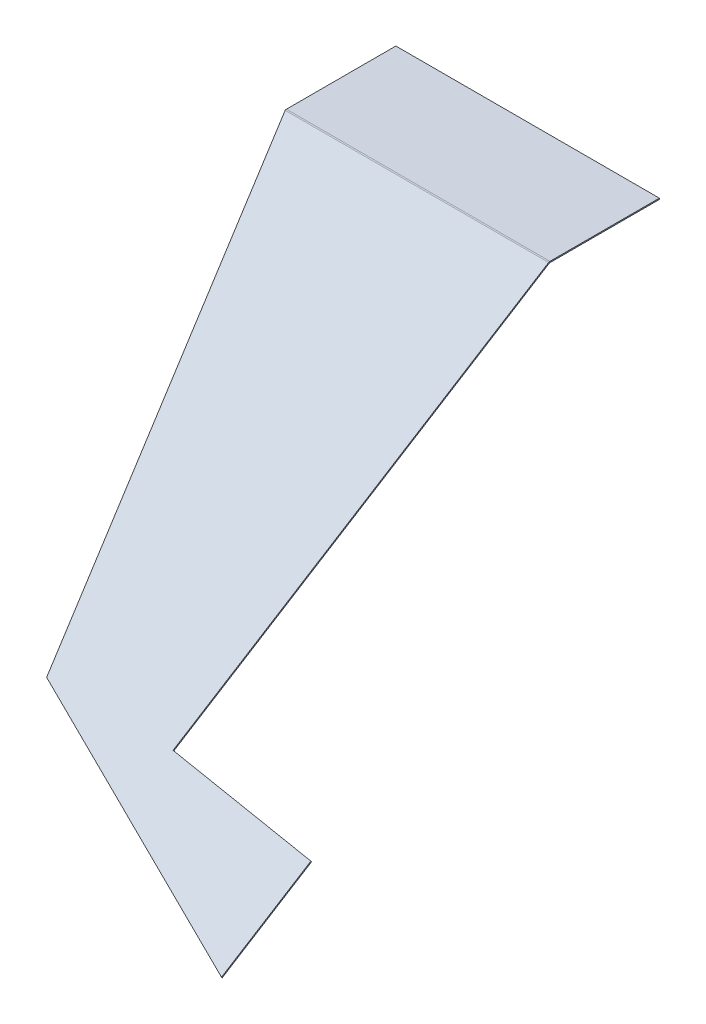
ISO-10303-21;
HEADER;
FILE_DESCRIPTION(('STEP AP214'),'2;1');
FILE_NAME('part.step','',(''),(''),'','','');
FILE_SCHEMA(('AUTOMOTIVE_DESIGN { 1 0 10303 214 1 1 1 1 }'));
ENDSEC;
DATA;
#1=APPLICATION_CONTEXT('core data for automotive mechanical design processes');
#2=APPLICATION_PROTOCOL_DEFINITION('international standard','automotive_design',2000,#1);
#3=PRODUCT_CONTEXT('',#1,'mechanical');
#4=PRODUCT('Part','Part','',(#3));
#5=PRODUCT_RELATED_PRODUCT_CATEGORY('part','',(#4));
#6=PRODUCT_DEFINITION_FORMATION('','',#4);
#7=PRODUCT_DEFINITION_CONTEXT('part definition',#1,'design');
#8=PRODUCT_DEFINITION('design','',#6,#7);
#9=PRODUCT_DEFINITION_SHAPE('','',#8);
#10=(LENGTH_UNIT() NAMED_UNIT(*) SI_UNIT(.MILLI.,.METRE.));
#11=(NAMED_UNIT(*) PLANE_ANGLE_UNIT() SI_UNIT($,.RADIAN.));
#12=(NAMED_UNIT(*) SI_UNIT($,.STERADIAN.) SOLID_ANGLE_UNIT());
#13=UNCERTAINTY_MEASURE_WITH_UNIT(LENGTH_MEASURE(1.E-05),#10,'distance_accuracy_value','');
#14=(GEOMETRIC_REPRESENTATION_CONTEXT(3) GLOBAL_UNCERTAINTY_ASSIGNED_CONTEXT((#13)) GLOBAL_UNIT_ASSIGNED_CONTEXT((#10,
#11,#12)) REPRESENTATION_CONTEXT('',''));
#15=CARTESIAN_POINT('',(0.,0.,0.));
#16=DIRECTION('',(0.,0.,1.));
#17=DIRECTION('',(1.,0.,0.));
#18=AXIS2_PLACEMENT_3D('',#15,#16,#17);
#19=CARTESIAN_POINT('',(-90.,-0.121561523074852,37.9239354113866));
#20=DIRECTION('',(0.,0.848048096156429,0.5299192642332));
#21=DIRECTION('',(0.,-0.5299192642332,0.848048096156429));
#22=AXIS2_PLACEMENT_3D('',#19,#20,#21);
#23=PLANE('',#22);
#24=DIRECTION('',(-1.,0.,0.));
#25=VECTOR('',#24,1.);
#26=CARTESIAN_POINT('',(-90.,-0.243123046149712,38.1184745141661));
#27=LINE('',#26,#25);
#28=CARTESIAN_POINT('',(90.,-0.24312304614971,38.1184745141661));
#29=VERTEX_POINT('',#28);
#30=CARTESIAN_POINT('',(-90.,-0.243123046149711,38.1184745141661));
#31=VERTEX_POINT('',#30);
#32=EDGE_CURVE('E150',#29,#31,#27,.T.);
#33=ORIENTED_EDGE('',*,*,#32,.T.);
#34=DIRECTION('',(-0.295708050044041,0.50622040679377,-0.810121996297287));
#35=VECTOR('',#34,1.);
#36=CARTESIAN_POINT('',(-90.0648006725352,-0.132191257832115,37.9409465429531));
#37=LINE('',#36,#35);
#38=CARTESIAN_POINT('',(3.65214793975983,-160.56553706266,294.687969444005));
#39=VERTEX_POINT('',#38);
#40=EDGE_CURVE('E123',#39,#31,#37,.T.);
#41=ORIENTED_EDGE('',*,*,#40,.F.);
#42=DIRECTION('',(0.913601253818773,-0.21547116075097,0.344825938562336));
#43=VECTOR('',#42,1.);
#44=CARTESIAN_POINT('',(3.65214793975983,-160.56553706266,294.687969444005));
#45=LINE('',#44,#43);
#46=CARTESIAN_POINT('',(195.499061090279,-205.812275604497,367.097887459001));
#47=VERTEX_POINT('',#46);
#48=EDGE_CURVE('E118',#39,#47,#45,.T.);
#49=ORIENTED_EDGE('',*,*,#48,.T.);
#50=DIRECTION('',(0.,0.5299192642332,-0.848048096156429));
#51=VECTOR('',#50,1.);
#52=CARTESIAN_POINT('',(195.499061090279,-205.812275604497,367.097887459001));
#53=LINE('',#52,#51);
#54=CARTESIAN_POINT('',(195.499061090279,-167.659772999828,306.041120171419));
#55=VERTEX_POINT('',#54);
#56=EDGE_CURVE('E254',#47,#55,#53,.T.);
#57=ORIENTED_EDGE('',*,*,#56,.T.);
#58=DIRECTION('',(-0.992044672987226,0.0667095886697956,-0.106757658166401));
#59=VECTOR('',#58,1.);
#60=CARTESIAN_POINT('',(195.499061090279,-167.659772999828,306.041120171419));
#61=LINE('',#60,#59);
#62=CARTESIAN_POINT('',(90.,-160.56553706266,294.687969444005));
#63=VERTEX_POINT('',#62);
#64=EDGE_CURVE('E135',#55,#63,#61,.T.);
#65=ORIENTED_EDGE('',*,*,#64,.T.);
#66=DIRECTION('',(0.,-0.5299192642332,0.848048096156429));
#67=VECTOR('',#66,1.);
#68=CARTESIAN_POINT('',(90.,-160.56553706266,294.687969444005));
#69=LINE('',#68,#67);
#70=EDGE_CURVE('E156',#29,#63,#69,.T.);
#71=ORIENTED_EDGE('',*,*,#70,.F.);
#72=EDGE_LOOP('',(#33,#41,#49,#57,#65,#71));
#73=FACE_BOUND('',#72,.T.);
#74=ADVANCED_FACE('F35',(#73),#23,.T.);
#75=CARTESIAN_POINT('',(-90.,-0.799999999999995,37.5));
#76=DIRECTION('',(0.,0.848048096156429,0.5299192642332));
#77=DIRECTION('',(0.,-0.5299192642332,0.848048096156429));
#78=AXIS2_PLACEMENT_3D('',#75,#76,#77);
#79=PLANE('',#78);
#80=DIRECTION('',(-0.295708050044041,0.50622040679377,-0.810121996297287));
#81=VECTOR('',#80,1.);
#82=CARTESIAN_POINT('',(-90.0648006725352,-0.810629734757257,37.5170111315666));
#83=LINE('',#82,#81);
#84=CARTESIAN_POINT('',(3.65214793975983,-161.243975539585,294.264034032619));
#85=VERTEX_POINT('',#84);
#86=CARTESIAN_POINT('',(-90.,-0.921561523074853,37.6945391027795));
#87=VERTEX_POINT('',#86);
#88=EDGE_CURVE('E130',#85,#87,#83,.T.);
#89=ORIENTED_EDGE('',*,*,#88,.T.);
#90=DIRECTION('',(-1.,0.,0.));
#91=VECTOR('',#90,1.);
#92=CARTESIAN_POINT('',(90.,-0.921561523074852,37.6945391027795));
#93=LINE('',#92,#91);
#94=CARTESIAN_POINT('',(90.,-0.921561523074857,37.6945391027795));
#95=VERTEX_POINT('',#94);
#96=EDGE_CURVE('E147',#95,#87,#93,.T.);
#97=ORIENTED_EDGE('',*,*,#96,.F.);
#98=DIRECTION('',(0.,-0.5299192642332,0.848048096156429));
#99=VECTOR('',#98,1.);
#100=CARTESIAN_POINT('',(90.,-161.243975539585,294.264034032618));
#101=LINE('',#100,#99);
#102=CARTESIAN_POINT('',(90.,-161.243975539585,294.264034032618));
#103=VERTEX_POINT('',#102);
#104=EDGE_CURVE('E155',#95,#103,#101,.T.);
#105=ORIENTED_EDGE('',*,*,#104,.T.);
#106=DIRECTION('',(-0.992044672987226,0.0667095886697956,-0.106757658166401));
#107=VECTOR('',#106,1.);
#108=CARTESIAN_POINT('',(195.499061090279,-168.338211476753,305.617184760033));
#109=LINE('',#108,#107);
#110=CARTESIAN_POINT('',(195.499061090279,-168.338211476753,305.617184760033));
#111=VERTEX_POINT('',#110);
#112=EDGE_CURVE('E219',#111,#103,#109,.T.);
#113=ORIENTED_EDGE('',*,*,#112,.F.);
#114=DIRECTION('',(0.,0.5299192642332,-0.848048096156429));
#115=VECTOR('',#114,1.);
#116=CARTESIAN_POINT('',(195.499061090279,-206.490714081422,366.673952047614));
#117=LINE('',#116,#115);
#118=CARTESIAN_POINT('',(195.499061090279,-206.490714081422,366.673952047614));
#119=VERTEX_POINT('',#118);
#120=EDGE_CURVE('E134',#119,#111,#117,.T.);
#121=ORIENTED_EDGE('',*,*,#120,.F.);
#122=DIRECTION('',(0.913601253818773,-0.21547116075097,0.344825938562336));
#123=VECTOR('',#122,1.);
#124=CARTESIAN_POINT('',(3.65214793975983,-161.243975539585,294.264034032619));
#125=LINE('',#124,#123);
#126=EDGE_CURVE('E116',#85,#119,#125,.T.);
#127=ORIENTED_EDGE('',*,*,#126,.F.);
#128=EDGE_LOOP('',(#89,#97,#105,#113,#121,#127));
#129=FACE_BOUND('',#128,.T.);
#130=ADVANCED_FACE('F128',(#129),#79,.F.);
#131=CARTESIAN_POINT('',(-90.,-0.8,37.5));
#132=DIRECTION('',(-1.,0.,0.));
#133=DIRECTION('',(0.,0.,1.));
#134=AXIS2_PLACEMENT_3D('',#131,#132,#133);
#135=PLANE('',#134);
#136=DIRECTION('',(0.,0.,1.));
#137=VECTOR('',#136,1.);
#138=CARTESIAN_POINT('',(-90.,-0.8,37.5));
#139=LINE('',#138,#137);
#140=CARTESIAN_POINT('',(-90.,-0.8,-37.5));
#141=VERTEX_POINT('',#140);
#142=CARTESIAN_POINT('',(-90.,-0.8,37.270603691393));
#143=VERTEX_POINT('',#142);
#144=EDGE_CURVE('E189',#141,#143,#139,.T.);
#145=ORIENTED_EDGE('',*,*,#144,.T.);
#146=DIRECTION('',(0.,1.,0.));
#147=VECTOR('',#146,1.);
#148=CARTESIAN_POINT('',(-89.9999999999999,-0.800000000000032,37.270603691393));
#149=LINE('',#148,#147);
#150=CARTESIAN_POINT('',(-89.9999999999999,0.,37.270603691393));
#151=VERTEX_POINT('',#150);
#152=EDGE_CURVE('E171',#143,#151,#149,.T.);
#153=ORIENTED_EDGE('',*,*,#152,.T.);
#154=DIRECTION('',(0.,0.,1.));
#155=VECTOR('',#154,1.);
#156=CARTESIAN_POINT('',(-90.,0.,37.5));
#157=LINE('',#156,#155);
#158=CARTESIAN_POINT('',(-90.,0.,-37.5));
#159=VERTEX_POINT('',#158);
#160=EDGE_CURVE('E186',#159,#151,#157,.T.);
#161=ORIENTED_EDGE('',*,*,#160,.F.);
#162=DIRECTION('',(0.,1.,0.));
#163=VECTOR('',#162,1.);
#164=CARTESIAN_POINT('',(-90.,-0.8,-37.5));
#165=LINE('',#164,#163);
#166=EDGE_CURVE('E11',#141,#159,#165,.T.);
#167=ORIENTED_EDGE('',*,*,#166,.F.);
#168=EDGE_LOOP('',(#145,#153,#161,#167));
#169=FACE_BOUND('',#168,.T.);
#170=ADVANCED_FACE('F236',(#169),#135,.T.);
#171=CARTESIAN_POINT('',(89.9999999999999,-0.8,-37.5));
#172=DIRECTION('',(0.,-1.,0.));
#173=DIRECTION('',(0.,0.,-1.));
#174=AXIS2_PLACEMENT_3D('',#171,#172,#173);
#175=PLANE('',#174);
#176=DIRECTION('',(0.,0.,-1.));
#177=VECTOR('',#176,1.);
#178=CARTESIAN_POINT('',(90.,-0.8,37.5));
#179=LINE('',#178,#177);
#180=CARTESIAN_POINT('',(90.,-0.8,37.270603691393));
#181=VERTEX_POINT('',#180);
#182=CARTESIAN_POINT('',(90.,-0.8,-37.5));
#183=VERTEX_POINT('',#182);
#184=EDGE_CURVE('E183',#181,#183,#179,.T.);
#185=ORIENTED_EDGE('',*,*,#184,.F.);
#186=DIRECTION('',(-1.,0.,0.));
#187=VECTOR('',#186,1.);
#188=CARTESIAN_POINT('',(-90.,-0.800000000000032,37.270603691393));
#189=LINE('',#188,#187);
#190=EDGE_CURVE('E50',#143,#181,#189,.F.);
#191=ORIENTED_EDGE('',*,*,#190,.F.);
#192=ORIENTED_EDGE('',*,*,#144,.F.);
#193=DIRECTION('',(-1.,0.,0.));
#194=VECTOR('',#193,1.);
#195=CARTESIAN_POINT('',(-90.,-0.8,-37.5));
#196=LINE('',#195,#194);
#197=EDGE_CURVE('E185',#183,#141,#196,.T.);
#198=ORIENTED_EDGE('',*,*,#197,.F.);
#199=EDGE_LOOP('',(#185,#191,#192,#198));
#200=FACE_BOUND('',#199,.T.);
#201=ADVANCED_FACE('F355',(#200),#175,.T.);
#202=CARTESIAN_POINT('',(89.9999999999999,0.,-37.5));
#203=DIRECTION('',(0.,-1.,0.));
#204=DIRECTION('',(0.,0.,-1.));
#205=AXIS2_PLACEMENT_3D('',#202,#203,#204);
#206=PLANE('',#205);
#207=DIRECTION('',(-1.,0.,0.));
#208=VECTOR('',#207,1.);
#209=CARTESIAN_POINT('',(-90.,0.,37.270603691393));
#210=LINE('',#209,#208);
#211=CARTESIAN_POINT('',(90.,0.,37.270603691393));
#212=VERTEX_POINT('',#211);
#213=EDGE_CURVE('E165',#151,#212,#210,.F.);
#214=ORIENTED_EDGE('',*,*,#213,.T.);
#215=DIRECTION('',(0.,0.,-1.));
#216=VECTOR('',#215,1.);
#217=CARTESIAN_POINT('',(90.,0.,37.5));
#218=LINE('',#217,#216);
#219=CARTESIAN_POINT('',(90.,0.,-37.5));
#220=VERTEX_POINT('',#219);
#221=EDGE_CURVE('E181',#212,#220,#218,.T.);
#222=ORIENTED_EDGE('',*,*,#221,.T.);
#223=DIRECTION('',(-1.,0.,0.));
#224=VECTOR('',#223,1.);
#225=CARTESIAN_POINT('',(-90.,0.,-37.5));
#226=LINE('',#225,#224);
#227=EDGE_CURVE('E192',#220,#159,#226,.T.);
#228=ORIENTED_EDGE('',*,*,#227,.T.);
#229=ORIENTED_EDGE('',*,*,#160,.T.);
#230=EDGE_LOOP('',(#214,#222,#228,#229));
#231=FACE_BOUND('',#230,.T.);
#232=ADVANCED_FACE('F199',(#231),#206,.F.);
#233=CARTESIAN_POINT('',(90.,-0.8,37.5));
#234=DIRECTION('',(1.,0.,0.));
#235=DIRECTION('',(0.,0.,-1.));
#236=AXIS2_PLACEMENT_3D('',#233,#234,#235);
#237=PLANE('',#236);
#238=DIRECTION('',(0.,1.,0.));
#239=VECTOR('',#238,1.);
#240=CARTESIAN_POINT('',(90.,-0.800000000000008,37.270603691393));
#241=LINE('',#240,#239);
#242=EDGE_CURVE('E58',#181,#212,#241,.T.);
#243=ORIENTED_EDGE('',*,*,#242,.F.);
#244=ORIENTED_EDGE('',*,*,#184,.T.);
#245=DIRECTION('',(0.,1.,0.));
#246=VECTOR('',#245,1.);
#247=CARTESIAN_POINT('',(90.,-0.8,-37.5));
#248=LINE('',#247,#246);
#249=EDGE_CURVE('E39',#183,#220,#248,.T.);
#250=ORIENTED_EDGE('',*,*,#249,.T.);
#251=ORIENTED_EDGE('',*,*,#221,.F.);
#252=EDGE_LOOP('',(#243,#244,#250,#251));
#253=FACE_BOUND('',#252,.T.);
#254=ADVANCED_FACE('F37',(#253),#237,.T.);
#255=CARTESIAN_POINT('',(-90.,-0.8,-37.5));
#256=DIRECTION('',(0.,0.,-1.));
#257=DIRECTION('',(-1.,0.,0.));
#258=AXIS2_PLACEMENT_3D('',#255,#256,#257);
#259=PLANE('',#258);
#260=ORIENTED_EDGE('',*,*,#227,.F.);
#261=ORIENTED_EDGE('',*,*,#249,.F.);
#262=ORIENTED_EDGE('',*,*,#197,.T.);
#263=ORIENTED_EDGE('',*,*,#166,.T.);
#264=EDGE_LOOP('',(#260,#261,#262,#263));
#265=FACE_BOUND('',#264,.T.);
#266=ADVANCED_FACE('F346',(#265),#259,.T.);
#267=CARTESIAN_POINT('',(90.,-1.59999999999996,37.270603691393));
#268=DIRECTION('',(1.,0.,0.));
#269=DIRECTION('',(0.,1.,0.));
#270=AXIS2_PLACEMENT_3D('',#267,#268,#269);
#271=PLANE('',#270);
#272=DIRECTION('',(0.,0.848048096156429,0.5299192642332));
#273=VECTOR('',#272,1.);
#274=CARTESIAN_POINT('',(90.,-0.921561523074852,37.6945391027795));
#275=LINE('',#274,#273);
#276=EDGE_CURVE('E122',#95,#29,#275,.T.);
#277=ORIENTED_EDGE('',*,*,#276,.F.);
#278=CARTESIAN_POINT('',(90.,-1.59999999999996,37.270603691393));
#279=DIRECTION('',(-1.,0.,0.));
#280=DIRECTION('',(0.,-1.,0.));
#281=AXIS2_PLACEMENT_3D('',#278,#279,#280);
#282=CIRCLE('',#281,0.799999999999948);
#283=EDGE_CURVE('E174',#181,#95,#282,.F.);
#284=ORIENTED_EDGE('',*,*,#283,.F.);
#285=ORIENTED_EDGE('',*,*,#242,.T.);
#286=CARTESIAN_POINT('',(90.,-1.59999999999996,37.270603691393));
#287=DIRECTION('',(-1.,0.,0.));
#288=DIRECTION('',(0.,-1.,0.));
#289=AXIS2_PLACEMENT_3D('',#286,#287,#288);
#290=CIRCLE('',#289,1.59999999999995);
#291=EDGE_CURVE('E167',#212,#29,#290,.F.);
#292=ORIENTED_EDGE('',*,*,#291,.T.);
#293=EDGE_LOOP('',(#277,#284,#285,#292));
#294=FACE_BOUND('',#293,.T.);
#295=ADVANCED_FACE('F214',(#294),#271,.T.);
#296=CARTESIAN_POINT('',(-89.9999999999999,-1.59999999999998,37.270603691393));
#297=DIRECTION('',(1.,0.,0.));
#298=DIRECTION('',(0.,1.,0.));
#299=AXIS2_PLACEMENT_3D('',#296,#297,#298);
#300=PLANE('',#299);
#301=CARTESIAN_POINT('',(-89.9999999999999,-1.59999999999998,37.270603691393));
#302=DIRECTION('',(-1.,0.,0.));
#303=DIRECTION('',(0.,-1.,0.));
#304=AXIS2_PLACEMENT_3D('',#301,#302,#303);
#305=CIRCLE('',#304,0.799999999999948);
#306=EDGE_CURVE('E164',#87,#143,#305,.T.);
#307=ORIENTED_EDGE('',*,*,#306,.F.);
#308=DIRECTION('',(0.,0.848048096156429,0.5299192642332));
#309=VECTOR('',#308,1.);
#310=CARTESIAN_POINT('',(-89.9999999999999,-0.921561523074852,37.6945391027795));
#311=LINE('',#310,#309);
#312=EDGE_CURVE('E139',#87,#31,#311,.T.);
#313=ORIENTED_EDGE('',*,*,#312,.T.);
#314=CARTESIAN_POINT('',(-89.9999999999999,-1.59999999999998,37.270603691393));
#315=DIRECTION('',(-1.,0.,0.));
#316=DIRECTION('',(0.,-1.,0.));
#317=AXIS2_PLACEMENT_3D('',#314,#315,#316);
#318=CIRCLE('',#317,1.59999999999995);
#319=EDGE_CURVE('E168',#31,#151,#318,.T.);
#320=ORIENTED_EDGE('',*,*,#319,.T.);
#321=ORIENTED_EDGE('',*,*,#152,.F.);
#322=EDGE_LOOP('',(#307,#313,#320,#321));
#323=FACE_BOUND('',#322,.T.);
#324=ADVANCED_FACE('F209',(#323),#300,.F.);
#325=CARTESIAN_POINT('',(-90.,-1.59999999999998,37.270603691393));
#326=DIRECTION('',(-1.,0.,0.));
#327=DIRECTION('',(0.,0.848048096156429,0.5299192642332));
#328=AXIS2_PLACEMENT_3D('',#325,#326,#327);
#329=CYLINDRICAL_SURFACE('',#328,1.59999999999995);
#330=ORIENTED_EDGE('',*,*,#213,.F.);
#331=ORIENTED_EDGE('',*,*,#319,.F.);
#332=ORIENTED_EDGE('',*,*,#32,.F.);
#333=ORIENTED_EDGE('',*,*,#291,.F.);
#334=EDGE_LOOP('',(#330,#331,#332,#333));
#335=FACE_BOUND('',#334,.T.);
#336=ADVANCED_FACE('F205',(#335),#329,.T.);
#337=CARTESIAN_POINT('',(-90.,-1.59999999999998,37.270603691393));
#338=DIRECTION('',(-1.,0.,0.));
#339=DIRECTION('',(0.,0.848048096156429,0.5299192642332));
#340=AXIS2_PLACEMENT_3D('',#337,#338,#339);
#341=CYLINDRICAL_SURFACE('',#340,0.799999999999948);
#342=ORIENTED_EDGE('',*,*,#190,.T.);
#343=ORIENTED_EDGE('',*,*,#283,.T.);
#344=ORIENTED_EDGE('',*,*,#96,.T.);
#345=ORIENTED_EDGE('',*,*,#306,.T.);
#346=EDGE_LOOP('',(#342,#343,#344,#345));
#347=FACE_BOUND('',#346,.T.);
#348=ADVANCED_FACE('F221',(#347),#341,.F.);
#349=CARTESIAN_POINT('',(90.,-160.56553706266,294.687969444005));
#350=DIRECTION('',(1.,0.,0.));
#351=DIRECTION('',(0.,0.,-1.));
#352=AXIS2_PLACEMENT_3D('',#349,#350,#351);
#353=PLANE('',#352);
#354=ORIENTED_EDGE('',*,*,#104,.F.);
#355=ORIENTED_EDGE('',*,*,#276,.T.);
#356=ORIENTED_EDGE('',*,*,#70,.T.);
#357=DIRECTION('',(0.,-0.848048096156429,-0.5299192642332));
#358=VECTOR('',#357,1.);
#359=CARTESIAN_POINT('',(90.,-160.56553706266,294.687969444005));
#360=LINE('',#359,#358);
#361=EDGE_CURVE('E159',#63,#103,#360,.T.);
#362=ORIENTED_EDGE('',*,*,#361,.T.);
#363=EDGE_LOOP('',(#354,#355,#356,#362));
#364=FACE_BOUND('',#363,.T.);
#365=ADVANCED_FACE('F218',(#364),#353,.T.);
#366=CARTESIAN_POINT('',(-90.0648006725352,-0.810629734757257,37.5170111315666));
#367=DIRECTION('',(0.955278362122346,0.156701392307172,-0.250774648857979));
#368=DIRECTION('',(-0.295708050044041,0.50622040679377,-0.810121996297287));
#369=AXIS2_PLACEMENT_3D('',#366,#367,#368);
#370=PLANE('',#369);
#371=ORIENTED_EDGE('',*,*,#312,.F.);
#372=ORIENTED_EDGE('',*,*,#88,.F.);
#373=DIRECTION('',(0.,-0.848048096156429,-0.5299192642332));
#374=VECTOR('',#373,1.);
#375=CARTESIAN_POINT('',(3.65214793975981,-161.243975539585,294.264034032618));
#376=LINE('',#375,#374);
#377=EDGE_CURVE('E113',#85,#39,#376,.F.);
#378=ORIENTED_EDGE('',*,*,#377,.T.);
#379=ORIENTED_EDGE('',*,*,#40,.T.);
#380=EDGE_LOOP('',(#371,#372,#378,#379));
#381=FACE_BOUND('',#380,.T.);
#382=ADVANCED_FACE('F137',(#381),#370,.F.);
#383=CARTESIAN_POINT('',(195.499061090279,-168.338211476753,305.617184760033));
#384=DIRECTION('',(0.125886324903333,0.525703583195857,-0.841301596228944));
#385=DIRECTION('',(0.,0.848048096156429,0.5299192642332));
#386=AXIS2_PLACEMENT_3D('',#383,#384,#385);
#387=PLANE('',#386);
#388=ORIENTED_EDGE('',*,*,#64,.F.);
#389=DIRECTION('',(0.,0.848048096156429,0.5299192642332));
#390=VECTOR('',#389,1.);
#391=CARTESIAN_POINT('',(195.499061090279,-168.338211476753,305.617184760033));
#392=LINE('',#391,#390);
#393=EDGE_CURVE('E140',#111,#55,#392,.T.);
#394=ORIENTED_EDGE('',*,*,#393,.F.);
#395=ORIENTED_EDGE('',*,*,#112,.T.);
#396=ORIENTED_EDGE('',*,*,#361,.F.);
#397=EDGE_LOOP('',(#388,#394,#395,#396));
#398=FACE_BOUND('',#397,.T.);
#399=ADVANCED_FACE('F241',(#398),#387,.T.);
#400=CARTESIAN_POINT('',(195.499061090279,-206.490714081422,366.673952047614));
#401=DIRECTION('',(1.,0.,0.));
#402=DIRECTION('',(0.,0.,-1.));
#403=AXIS2_PLACEMENT_3D('',#400,#401,#402);
#404=PLANE('',#403);
#405=ORIENTED_EDGE('',*,*,#56,.F.);
#406=DIRECTION('',(0.,0.848048096156429,0.5299192642332));
#407=VECTOR('',#406,1.);
#408=CARTESIAN_POINT('',(195.499061090279,-206.490714081422,366.673952047614));
#409=LINE('',#408,#407);
#410=EDGE_CURVE('E143',#119,#47,#409,.T.);
#411=ORIENTED_EDGE('',*,*,#410,.F.);
#412=ORIENTED_EDGE('',*,*,#120,.T.);
#413=ORIENTED_EDGE('',*,*,#393,.T.);
#414=EDGE_LOOP('',(#405,#411,#412,#413));
#415=FACE_BOUND('',#414,.T.);
#416=ADVANCED_FACE('F244',(#415),#404,.T.);
#417=CARTESIAN_POINT('',(3.65214793975983,-161.243975539585,294.264034032619));
#418=DIRECTION('',(-0.40661129967177,-0.484134904226173,0.774777803947137));
#419=DIRECTION('',(0.,-0.848048096156429,-0.5299192642332));
#420=AXIS2_PLACEMENT_3D('',#417,#418,#419);
#421=PLANE('',#420);
#422=ORIENTED_EDGE('',*,*,#48,.F.);
#423=ORIENTED_EDGE('',*,*,#377,.F.);
#424=ORIENTED_EDGE('',*,*,#126,.T.);
#425=ORIENTED_EDGE('',*,*,#410,.T.);
#426=EDGE_LOOP('',(#422,#423,#424,#425));
#427=FACE_BOUND('',#426,.T.);
#428=ADVANCED_FACE('F115',(#427),#421,.T.);
#429=CLOSED_SHELL('',(#74,#130,#170,#201,#232,#254,#266,#295,#324,#336,#348,#365,#382,#399,#416,#428));
#430=MANIFOLD_SOLID_BREP('B2',#429);
#431=ADVANCED_BREP_SHAPE_REPRESENTATION('',(#18,#430),#14);
#432=SHAPE_DEFINITION_REPRESENTATION(#9,#431);
ENDSEC;
END-ISO-10303-21;
